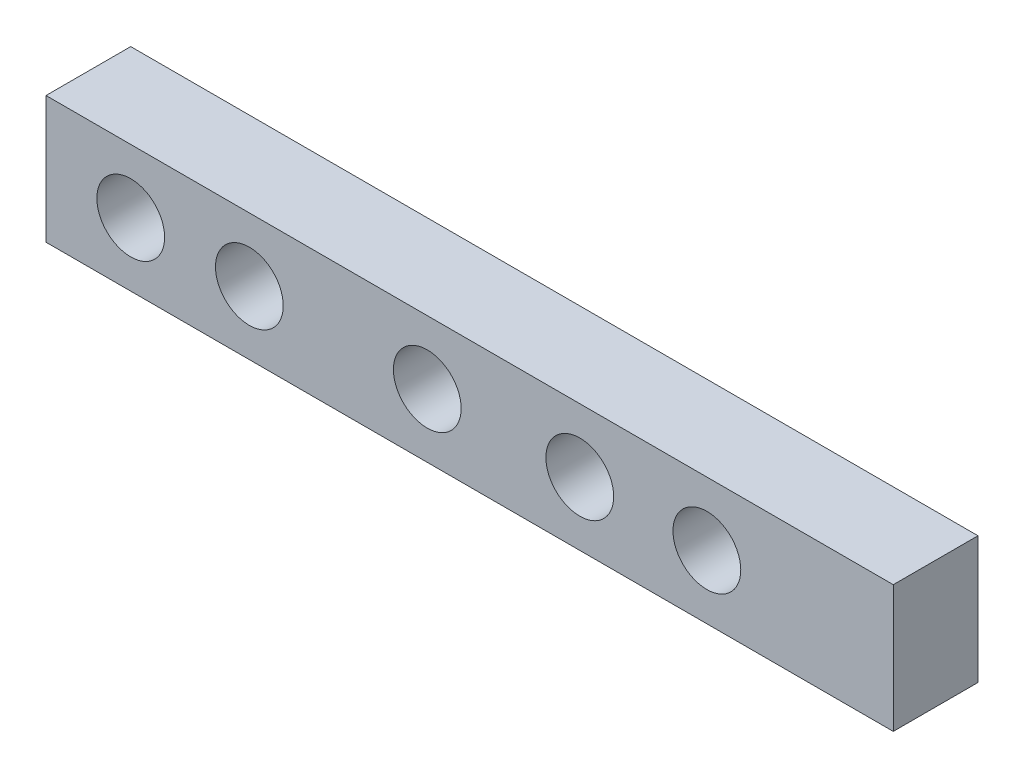
ISO-10303-21;
HEADER;
FILE_DESCRIPTION(('STEP AP214'),'2;1');
FILE_NAME('part.step','',(''),(''),'','','');
FILE_SCHEMA(('AUTOMOTIVE_DESIGN { 1 0 10303 214 1 1 1 1 }'));
ENDSEC;
DATA;
#1=APPLICATION_CONTEXT('core data for automotive mechanical design processes');
#2=APPLICATION_PROTOCOL_DEFINITION('international standard','automotive_design',2000,#1);
#3=PRODUCT_CONTEXT('',#1,'mechanical');
#4=PRODUCT('Part','Part','',(#3));
#5=PRODUCT_RELATED_PRODUCT_CATEGORY('part','',(#4));
#6=PRODUCT_DEFINITION_FORMATION('','',#4);
#7=PRODUCT_DEFINITION_CONTEXT('part definition',#1,'design');
#8=PRODUCT_DEFINITION('design','',#6,#7);
#9=PRODUCT_DEFINITION_SHAPE('','',#8);
#10=(LENGTH_UNIT() NAMED_UNIT(*) SI_UNIT(.MILLI.,.METRE.));
#11=(NAMED_UNIT(*) PLANE_ANGLE_UNIT() SI_UNIT($,.RADIAN.));
#12=(NAMED_UNIT(*) SI_UNIT($,.STERADIAN.) SOLID_ANGLE_UNIT());
#13=UNCERTAINTY_MEASURE_WITH_UNIT(LENGTH_MEASURE(1.E-05),#10,'distance_accuracy_value','');
#14=(GEOMETRIC_REPRESENTATION_CONTEXT(3) GLOBAL_UNCERTAINTY_ASSIGNED_CONTEXT((#13)) GLOBAL_UNIT_ASSIGNED_CONTEXT((#10,
#11,#12)) REPRESENTATION_CONTEXT('',''));
#15=CARTESIAN_POINT('',(0.,0.,0.));
#16=DIRECTION('',(0.,0.,1.));
#17=DIRECTION('',(1.,0.,0.));
#18=AXIS2_PLACEMENT_3D('',#15,#16,#17);
#19=CARTESIAN_POINT('',(0.,-7.50000000000001,10.));
#20=DIRECTION('',(0.,1.,0.));
#21=DIRECTION('',(-1.,0.,0.));
#22=AXIS2_PLACEMENT_3D('',#19,#20,#21);
#23=PLANE('',#22);
#24=DIRECTION('',(1.,0.,0.));
#25=VECTOR('',#24,1.);
#26=CARTESIAN_POINT('',(0.,-7.50000000000001,0.));
#27=LINE('',#26,#25);
#28=CARTESIAN_POINT('',(-50.,-7.5,0.));
#29=VERTEX_POINT('',#28);
#30=CARTESIAN_POINT('',(50.,-7.50000000000001,0.));
#31=VERTEX_POINT('',#30);
#32=EDGE_CURVE('E99',#29,#31,#27,.T.);
#33=ORIENTED_EDGE('',*,*,#32,.T.);
#34=DIRECTION('',(0.,0.,-1.));
#35=VECTOR('',#34,1.);
#36=CARTESIAN_POINT('',(50.,-7.50000000000001,10.));
#37=LINE('',#36,#35);
#38=CARTESIAN_POINT('',(50.,-7.50000000000001,10.));
#39=VERTEX_POINT('',#38);
#40=EDGE_CURVE('E11',#39,#31,#37,.T.);
#41=ORIENTED_EDGE('',*,*,#40,.F.);
#42=DIRECTION('',(1.,0.,0.));
#43=VECTOR('',#42,1.);
#44=CARTESIAN_POINT('',(0.,-7.50000000000001,10.));
#45=LINE('',#44,#43);
#46=CARTESIAN_POINT('',(-50.,-7.5,10.));
#47=VERTEX_POINT('',#46);
#48=EDGE_CURVE('E85',#47,#39,#45,.T.);
#49=ORIENTED_EDGE('',*,*,#48,.F.);
#50=DIRECTION('',(0.,0.,-1.));
#51=VECTOR('',#50,1.);
#52=CARTESIAN_POINT('',(-50.,-7.5,10.));
#53=LINE('',#52,#51);
#54=EDGE_CURVE('E52',#47,#29,#53,.T.);
#55=ORIENTED_EDGE('',*,*,#54,.T.);
#56=EDGE_LOOP('',(#33,#41,#49,#55));
#57=FACE_BOUND('',#56,.T.);
#58=ADVANCED_FACE('F36',(#57),#23,.F.);
#59=CARTESIAN_POINT('',(50.,0.,10.));
#60=DIRECTION('',(-1.,0.,0.));
#61=DIRECTION('',(0.,0.,1.));
#62=AXIS2_PLACEMENT_3D('',#59,#60,#61);
#63=PLANE('',#62);
#64=DIRECTION('',(0.,1.,0.));
#65=VECTOR('',#64,1.);
#66=CARTESIAN_POINT('',(50.,0.,0.));
#67=LINE('',#66,#65);
#68=CARTESIAN_POINT('',(50.,7.49999999999999,0.));
#69=VERTEX_POINT('',#68);
#70=EDGE_CURVE('E90',#31,#69,#67,.T.);
#71=ORIENTED_EDGE('',*,*,#70,.T.);
#72=DIRECTION('',(0.,0.,-1.));
#73=VECTOR('',#72,1.);
#74=CARTESIAN_POINT('',(50.,7.49999999999999,10.));
#75=LINE('',#74,#73);
#76=CARTESIAN_POINT('',(50.,7.49999999999999,10.));
#77=VERTEX_POINT('',#76);
#78=EDGE_CURVE('E44',#77,#69,#75,.T.);
#79=ORIENTED_EDGE('',*,*,#78,.F.);
#80=DIRECTION('',(0.,1.,0.));
#81=VECTOR('',#80,1.);
#82=CARTESIAN_POINT('',(50.,0.,10.));
#83=LINE('',#82,#81);
#84=EDGE_CURVE('E77',#39,#77,#83,.T.);
#85=ORIENTED_EDGE('',*,*,#84,.F.);
#86=ORIENTED_EDGE('',*,*,#40,.T.);
#87=EDGE_LOOP('',(#71,#79,#85,#86));
#88=FACE_BOUND('',#87,.T.);
#89=ADVANCED_FACE('F89',(#88),#63,.F.);
#90=CARTESIAN_POINT('',(0.,7.5,10.));
#91=DIRECTION('',(0.,1.,0.));
#92=DIRECTION('',(-1.,0.,0.));
#93=AXIS2_PLACEMENT_3D('',#90,#91,#92);
#94=PLANE('',#93);
#95=DIRECTION('',(1.,0.,0.));
#96=VECTOR('',#95,1.);
#97=CARTESIAN_POINT('',(0.,7.5,0.));
#98=LINE('',#97,#96);
#99=CARTESIAN_POINT('',(-50.,7.5,0.));
#100=VERTEX_POINT('',#99);
#101=EDGE_CURVE('E103',#100,#69,#98,.T.);
#102=ORIENTED_EDGE('',*,*,#101,.F.);
#103=DIRECTION('',(0.,0.,-1.));
#104=VECTOR('',#103,1.);
#105=CARTESIAN_POINT('',(-50.,7.5,10.));
#106=LINE('',#105,#104);
#107=CARTESIAN_POINT('',(-50.,7.5,10.));
#108=VERTEX_POINT('',#107);
#109=EDGE_CURVE('E66',#108,#100,#106,.T.);
#110=ORIENTED_EDGE('',*,*,#109,.F.);
#111=DIRECTION('',(1.,0.,0.));
#112=VECTOR('',#111,1.);
#113=CARTESIAN_POINT('',(0.,7.5,10.));
#114=LINE('',#113,#112);
#115=EDGE_CURVE('E84',#108,#77,#114,.T.);
#116=ORIENTED_EDGE('',*,*,#115,.T.);
#117=ORIENTED_EDGE('',*,*,#78,.T.);
#118=EDGE_LOOP('',(#102,#110,#116,#117));
#119=FACE_BOUND('',#118,.T.);
#120=ADVANCED_FACE('F93',(#119),#94,.T.);
#121=CARTESIAN_POINT('',(-50.,0.,10.));
#122=DIRECTION('',(-1.,0.,0.));
#123=DIRECTION('',(0.,0.,1.));
#124=AXIS2_PLACEMENT_3D('',#121,#122,#123);
#125=PLANE('',#124);
#126=DIRECTION('',(0.,1.,0.));
#127=VECTOR('',#126,1.);
#128=CARTESIAN_POINT('',(-50.,0.,0.));
#129=LINE('',#128,#127);
#130=EDGE_CURVE('E105',#29,#100,#129,.T.);
#131=ORIENTED_EDGE('',*,*,#130,.F.);
#132=ORIENTED_EDGE('',*,*,#54,.F.);
#133=DIRECTION('',(0.,1.,0.));
#134=VECTOR('',#133,1.);
#135=CARTESIAN_POINT('',(-50.,0.,10.));
#136=LINE('',#135,#134);
#137=EDGE_CURVE('E94',#47,#108,#136,.T.);
#138=ORIENTED_EDGE('',*,*,#137,.T.);
#139=ORIENTED_EDGE('',*,*,#109,.T.);
#140=EDGE_LOOP('',(#131,#132,#138,#139));
#141=FACE_BOUND('',#140,.T.);
#142=ADVANCED_FACE('F153',(#141),#125,.T.);
#143=CARTESIAN_POINT('',(0.,0.,10.));
#144=DIRECTION('',(0.,0.,1.));
#145=DIRECTION('',(1.,0.,0.));
#146=AXIS2_PLACEMENT_3D('',#143,#144,#145);
#147=PLANE('',#146);
#148=CARTESIAN_POINT('',(28.,0.,10.));
#149=DIRECTION('',(0.,0.,1.));
#150=DIRECTION('',(1.,0.,0.));
#151=AXIS2_PLACEMENT_3D('',#148,#149,#150);
#152=CIRCLE('',#151,4.);
#153=CARTESIAN_POINT('',(32.,0.,10.));
#154=VERTEX_POINT('',#153);
#155=EDGE_CURVE('E135',#154,#154,#152,.T.);
#156=ORIENTED_EDGE('',*,*,#155,.F.);
#157=EDGE_LOOP('',(#156));
#158=FACE_BOUND('',#157,.T.);
#159=CARTESIAN_POINT('',(13.,0.,10.));
#160=DIRECTION('',(0.,0.,1.));
#161=DIRECTION('',(1.,0.,0.));
#162=AXIS2_PLACEMENT_3D('',#159,#160,#161);
#163=CIRCLE('',#162,3.99999999999999);
#164=CARTESIAN_POINT('',(17.,0.,10.));
#165=VERTEX_POINT('',#164);
#166=EDGE_CURVE('E129',#165,#165,#163,.T.);
#167=ORIENTED_EDGE('',*,*,#166,.F.);
#168=EDGE_LOOP('',(#167));
#169=FACE_BOUND('',#168,.T.);
#170=CARTESIAN_POINT('',(-5.00000000000001,0.,10.));
#171=DIRECTION('',(0.,0.,1.));
#172=DIRECTION('',(1.,0.,0.));
#173=AXIS2_PLACEMENT_3D('',#170,#171,#172);
#174=CIRCLE('',#173,4.);
#175=CARTESIAN_POINT('',(-1.00000000000001,0.,10.));
#176=VERTEX_POINT('',#175);
#177=EDGE_CURVE('E123',#176,#176,#174,.T.);
#178=ORIENTED_EDGE('',*,*,#177,.F.);
#179=EDGE_LOOP('',(#178));
#180=FACE_BOUND('',#179,.T.);
#181=CARTESIAN_POINT('',(-26.,0.,10.));
#182=DIRECTION('',(0.,0.,1.));
#183=DIRECTION('',(1.,0.,0.));
#184=AXIS2_PLACEMENT_3D('',#181,#182,#183);
#185=CIRCLE('',#184,4.00000000000001);
#186=CARTESIAN_POINT('',(-22.,0.,10.));
#187=VERTEX_POINT('',#186);
#188=EDGE_CURVE('E117',#187,#187,#185,.T.);
#189=ORIENTED_EDGE('',*,*,#188,.F.);
#190=EDGE_LOOP('',(#189));
#191=FACE_BOUND('',#190,.T.);
#192=CARTESIAN_POINT('',(-40.,0.,10.));
#193=DIRECTION('',(0.,0.,1.));
#194=DIRECTION('',(1.,0.,0.));
#195=AXIS2_PLACEMENT_3D('',#192,#193,#194);
#196=CIRCLE('',#195,3.99999999999999);
#197=CARTESIAN_POINT('',(-36.,0.,10.));
#198=VERTEX_POINT('',#197);
#199=EDGE_CURVE('E111',#198,#198,#196,.T.);
#200=ORIENTED_EDGE('',*,*,#199,.F.);
#201=EDGE_LOOP('',(#200));
#202=FACE_BOUND('',#201,.T.);
#203=ORIENTED_EDGE('',*,*,#48,.T.);
#204=ORIENTED_EDGE('',*,*,#84,.T.);
#205=ORIENTED_EDGE('',*,*,#115,.F.);
#206=ORIENTED_EDGE('',*,*,#137,.F.);
#207=EDGE_LOOP('',(#203,#204,#205,#206));
#208=FACE_BOUND('',#207,.T.);
#209=ADVANCED_FACE('F81',(#158,#169,#180,#191,#202,#208),#147,.T.);
#210=CARTESIAN_POINT('',(0.,0.,0.));
#211=DIRECTION('',(0.,0.,1.));
#212=DIRECTION('',(1.,0.,0.));
#213=AXIS2_PLACEMENT_3D('',#210,#211,#212);
#214=PLANE('',#213);
#215=CARTESIAN_POINT('',(28.,0.,0.));
#216=DIRECTION('',(0.,0.,1.));
#217=DIRECTION('',(1.,0.,0.));
#218=AXIS2_PLACEMENT_3D('',#215,#216,#217);
#219=CIRCLE('',#218,4.);
#220=CARTESIAN_POINT('',(32.,0.,0.));
#221=VERTEX_POINT('',#220);
#222=EDGE_CURVE('E132',#221,#221,#219,.T.);
#223=ORIENTED_EDGE('',*,*,#222,.T.);
#224=EDGE_LOOP('',(#223));
#225=FACE_BOUND('',#224,.T.);
#226=CARTESIAN_POINT('',(13.,0.,0.));
#227=DIRECTION('',(0.,0.,1.));
#228=DIRECTION('',(1.,0.,0.));
#229=AXIS2_PLACEMENT_3D('',#226,#227,#228);
#230=CIRCLE('',#229,3.99999999999999);
#231=CARTESIAN_POINT('',(17.,0.,0.));
#232=VERTEX_POINT('',#231);
#233=EDGE_CURVE('E126',#232,#232,#230,.T.);
#234=ORIENTED_EDGE('',*,*,#233,.T.);
#235=EDGE_LOOP('',(#234));
#236=FACE_BOUND('',#235,.T.);
#237=CARTESIAN_POINT('',(-5.00000000000001,0.,0.));
#238=DIRECTION('',(0.,0.,1.));
#239=DIRECTION('',(1.,0.,0.));
#240=AXIS2_PLACEMENT_3D('',#237,#238,#239);
#241=CIRCLE('',#240,4.);
#242=CARTESIAN_POINT('',(-1.00000000000001,0.,0.));
#243=VERTEX_POINT('',#242);
#244=EDGE_CURVE('E120',#243,#243,#241,.T.);
#245=ORIENTED_EDGE('',*,*,#244,.T.);
#246=EDGE_LOOP('',(#245));
#247=FACE_BOUND('',#246,.T.);
#248=CARTESIAN_POINT('',(-26.,0.,0.));
#249=DIRECTION('',(0.,0.,1.));
#250=DIRECTION('',(1.,0.,0.));
#251=AXIS2_PLACEMENT_3D('',#248,#249,#250);
#252=CIRCLE('',#251,4.00000000000001);
#253=CARTESIAN_POINT('',(-22.,0.,0.));
#254=VERTEX_POINT('',#253);
#255=EDGE_CURVE('E114',#254,#254,#252,.T.);
#256=ORIENTED_EDGE('',*,*,#255,.T.);
#257=EDGE_LOOP('',(#256));
#258=FACE_BOUND('',#257,.T.);
#259=CARTESIAN_POINT('',(-40.,0.,0.));
#260=DIRECTION('',(0.,0.,1.));
#261=DIRECTION('',(1.,0.,0.));
#262=AXIS2_PLACEMENT_3D('',#259,#260,#261);
#263=CIRCLE('',#262,3.99999999999999);
#264=CARTESIAN_POINT('',(-36.,0.,0.));
#265=VERTEX_POINT('',#264);
#266=EDGE_CURVE('E101',#265,#265,#263,.T.);
#267=ORIENTED_EDGE('',*,*,#266,.T.);
#268=EDGE_LOOP('',(#267));
#269=FACE_BOUND('',#268,.T.);
#270=ORIENTED_EDGE('',*,*,#32,.F.);
#271=ORIENTED_EDGE('',*,*,#130,.T.);
#272=ORIENTED_EDGE('',*,*,#101,.T.);
#273=ORIENTED_EDGE('',*,*,#70,.F.);
#274=EDGE_LOOP('',(#270,#271,#272,#273));
#275=FACE_BOUND('',#274,.T.);
#276=ADVANCED_FACE('F141',(#225,#236,#247,#258,#269,#275),#214,.F.);
#277=CARTESIAN_POINT('',(-40.,0.,0.));
#278=DIRECTION('',(0.,0.,1.));
#279=DIRECTION('',(1.,0.,0.));
#280=AXIS2_PLACEMENT_3D('',#277,#278,#279);
#281=CYLINDRICAL_SURFACE('',#280,3.99999999999999);
#282=ORIENTED_EDGE('',*,*,#266,.F.);
#283=EDGE_LOOP('',(#282));
#284=FACE_BOUND('',#283,.T.);
#285=ORIENTED_EDGE('',*,*,#199,.T.);
#286=EDGE_LOOP('',(#285));
#287=FACE_BOUND('',#286,.T.);
#288=ADVANCED_FACE('F163',(#284,#287),#281,.F.);
#289=CARTESIAN_POINT('',(-26.,0.,0.));
#290=DIRECTION('',(0.,0.,1.));
#291=DIRECTION('',(1.,0.,0.));
#292=AXIS2_PLACEMENT_3D('',#289,#290,#291);
#293=CYLINDRICAL_SURFACE('',#292,4.00000000000001);
#294=ORIENTED_EDGE('',*,*,#255,.F.);
#295=EDGE_LOOP('',(#294));
#296=FACE_BOUND('',#295,.T.);
#297=ORIENTED_EDGE('',*,*,#188,.T.);
#298=EDGE_LOOP('',(#297));
#299=FACE_BOUND('',#298,.T.);
#300=ADVANCED_FACE('F165',(#296,#299),#293,.F.);
#301=CARTESIAN_POINT('',(-5.00000000000001,0.,0.));
#302=DIRECTION('',(0.,0.,1.));
#303=DIRECTION('',(1.,0.,0.));
#304=AXIS2_PLACEMENT_3D('',#301,#302,#303);
#305=CYLINDRICAL_SURFACE('',#304,4.);
#306=ORIENTED_EDGE('',*,*,#244,.F.);
#307=EDGE_LOOP('',(#306));
#308=FACE_BOUND('',#307,.T.);
#309=ORIENTED_EDGE('',*,*,#177,.T.);
#310=EDGE_LOOP('',(#309));
#311=FACE_BOUND('',#310,.T.);
#312=ADVANCED_FACE('F172',(#308,#311),#305,.F.);
#313=CARTESIAN_POINT('',(13.,0.,0.));
#314=DIRECTION('',(0.,0.,1.));
#315=DIRECTION('',(1.,0.,0.));
#316=AXIS2_PLACEMENT_3D('',#313,#314,#315);
#317=CYLINDRICAL_SURFACE('',#316,3.99999999999999);
#318=ORIENTED_EDGE('',*,*,#233,.F.);
#319=EDGE_LOOP('',(#318));
#320=FACE_BOUND('',#319,.T.);
#321=ORIENTED_EDGE('',*,*,#166,.T.);
#322=EDGE_LOOP('',(#321));
#323=FACE_BOUND('',#322,.T.);
#324=ADVANCED_FACE('F147',(#320,#323),#317,.F.);
#325=CARTESIAN_POINT('',(28.,0.,0.));
#326=DIRECTION('',(0.,0.,1.));
#327=DIRECTION('',(1.,0.,0.));
#328=AXIS2_PLACEMENT_3D('',#325,#326,#327);
#329=CYLINDRICAL_SURFACE('',#328,4.);
#330=ORIENTED_EDGE('',*,*,#222,.F.);
#331=EDGE_LOOP('',(#330));
#332=FACE_BOUND('',#331,.T.);
#333=ORIENTED_EDGE('',*,*,#155,.T.);
#334=EDGE_LOOP('',(#333));
#335=FACE_BOUND('',#334,.T.);
#336=ADVANCED_FACE('F144',(#332,#335),#329,.F.);
#337=CLOSED_SHELL('',(#58,#89,#120,#142,#209,#276,#288,#300,#312,#324,#336));
#338=MANIFOLD_SOLID_BREP('B2',#337);
#339=ADVANCED_BREP_SHAPE_REPRESENTATION('',(#18,#338),#14);
#340=SHAPE_DEFINITION_REPRESENTATION(#9,#339);
ENDSEC;
END-ISO-10303-21;
